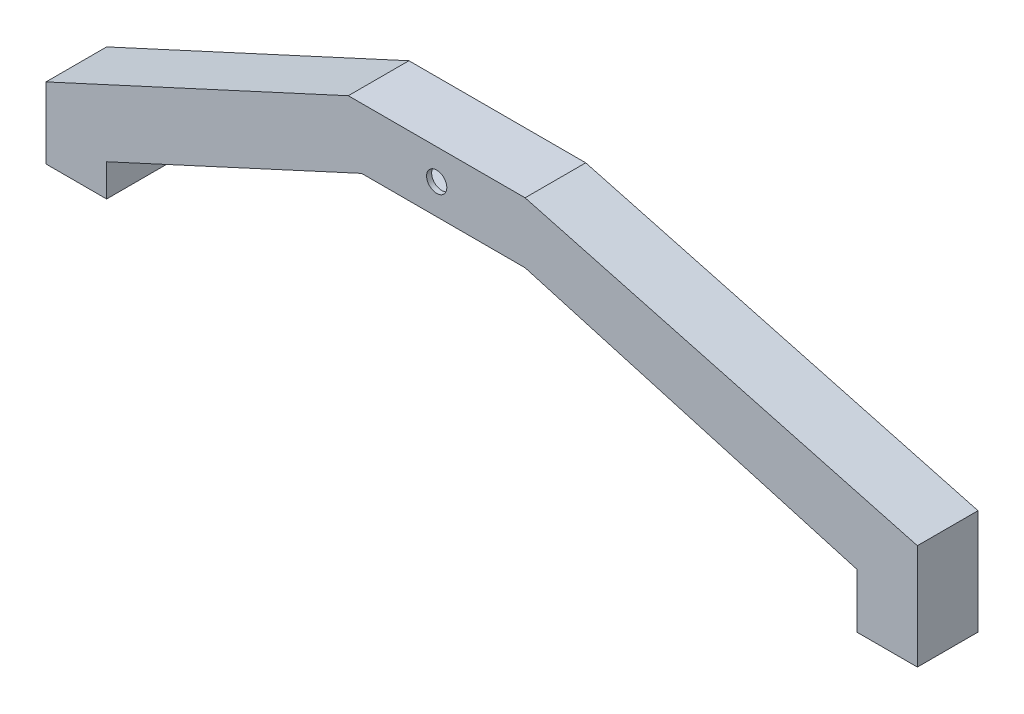
ISO-10303-21;
HEADER;
FILE_DESCRIPTION(('STEP AP214'),'2;1');
FILE_NAME('part.step','',(''),(''),'','','');
FILE_SCHEMA(('AUTOMOTIVE_DESIGN { 1 0 10303 214 1 1 1 1 }'));
ENDSEC;
DATA;
#1=APPLICATION_CONTEXT('core data for automotive mechanical design processes');
#2=APPLICATION_PROTOCOL_DEFINITION('international standard','automotive_design',2000,#1);
#3=PRODUCT_CONTEXT('',#1,'mechanical');
#4=PRODUCT('Part','Part','',(#3));
#5=PRODUCT_RELATED_PRODUCT_CATEGORY('part','',(#4));
#6=PRODUCT_DEFINITION_FORMATION('','',#4);
#7=PRODUCT_DEFINITION_CONTEXT('part definition',#1,'design');
#8=PRODUCT_DEFINITION('design','',#6,#7);
#9=PRODUCT_DEFINITION_SHAPE('','',#8);
#10=(LENGTH_UNIT() NAMED_UNIT(*) SI_UNIT(.MILLI.,.METRE.));
#11=(NAMED_UNIT(*) PLANE_ANGLE_UNIT() SI_UNIT($,.RADIAN.));
#12=(NAMED_UNIT(*) SI_UNIT($,.STERADIAN.) SOLID_ANGLE_UNIT());
#13=UNCERTAINTY_MEASURE_WITH_UNIT(LENGTH_MEASURE(1.E-05),#10,'distance_accuracy_value','');
#14=(GEOMETRIC_REPRESENTATION_CONTEXT(3) GLOBAL_UNCERTAINTY_ASSIGNED_CONTEXT((#13)) GLOBAL_UNIT_ASSIGNED_CONTEXT((#10,
#11,#12)) REPRESENTATION_CONTEXT('',''));
#15=CARTESIAN_POINT('',(0.,0.,0.));
#16=DIRECTION('',(0.,0.,1.));
#17=DIRECTION('',(1.,0.,0.));
#18=AXIS2_PLACEMENT_3D('',#15,#16,#17);
#19=CARTESIAN_POINT('',(0.,-35.63,12.));
#20=DIRECTION('',(0.,1.,0.));
#21=DIRECTION('',(0.,0.,1.));
#22=AXIS2_PLACEMENT_3D('',#19,#20,#21);
#23=PLANE('',#22);
#24=DIRECTION('',(-1.,0.,0.));
#25=VECTOR('',#24,1.);
#26=CARTESIAN_POINT('',(84.1570943734744,-35.63,11.1013641627953));
#27=LINE('',#26,#25);
#28=CARTESIAN_POINT('',(94.1570943734744,-35.63,11.1013641627953));
#29=VERTEX_POINT('',#28);
#30=CARTESIAN_POINT('',(84.1570943734744,-35.63,11.1013641627953));
#31=VERTEX_POINT('',#30);
#32=EDGE_CURVE('E445',#29,#31,#27,.T.);
#33=ORIENTED_EDGE('',*,*,#32,.F.);
#34=DIRECTION('',(0.,0.,1.));
#35=VECTOR('',#34,1.);
#36=CARTESIAN_POINT('',(94.1570943734744,-35.63,11.1013641627953));
#37=LINE('',#36,#35);
#38=CARTESIAN_POINT('',(94.1570943734744,-35.63,1.10136416279526));
#39=VERTEX_POINT('',#38);
#40=EDGE_CURVE('E59',#39,#29,#37,.T.);
#41=ORIENTED_EDGE('',*,*,#40,.F.);
#42=DIRECTION('',(1.,0.,0.));
#43=VECTOR('',#42,1.);
#44=CARTESIAN_POINT('',(84.1570943734744,-35.63,1.10136416279526));
#45=LINE('',#44,#43);
#46=CARTESIAN_POINT('',(84.1570943734744,-35.63,1.10136416279526));
#47=VERTEX_POINT('',#46);
#48=EDGE_CURVE('E323',#47,#39,#45,.T.);
#49=ORIENTED_EDGE('',*,*,#48,.F.);
#50=DIRECTION('',(0.,0.,-1.));
#51=VECTOR('',#50,1.);
#52=CARTESIAN_POINT('',(84.1570943734744,-35.63,11.1013641627953));
#53=LINE('',#52,#51);
#54=EDGE_CURVE('E448',#31,#47,#53,.T.);
#55=ORIENTED_EDGE('',*,*,#54,.F.);
#56=EDGE_LOOP('',(#33,#41,#49,#55));
#57=FACE_BOUND('',#56,.T.);
#58=DIRECTION('',(0.,0.,-1.));
#59=VECTOR('',#58,1.);
#60=CARTESIAN_POINT('',(83.1570943734744,-35.63,0.));
#61=LINE('',#60,#59);
#62=CARTESIAN_POINT('',(83.1570943734744,-35.63,12.));
#63=VERTEX_POINT('',#62);
#64=CARTESIAN_POINT('',(83.1570943734744,-35.63,0.));
#65=VERTEX_POINT('',#64);
#66=EDGE_CURVE('E233',#63,#65,#61,.T.);
#67=ORIENTED_EDGE('',*,*,#66,.T.);
#68=DIRECTION('',(1.,0.,0.));
#69=VECTOR('',#68,1.);
#70=CARTESIAN_POINT('',(0.,-35.63,0.));
#71=LINE('',#70,#69);
#72=CARTESIAN_POINT('',(95.1570943734744,-35.63,0.));
#73=VERTEX_POINT('',#72);
#74=EDGE_CURVE('E243',#65,#73,#71,.T.);
#75=ORIENTED_EDGE('',*,*,#74,.T.);
#76=DIRECTION('',(0.,0.,-1.));
#77=VECTOR('',#76,1.);
#78=CARTESIAN_POINT('',(95.1570943734744,-35.63,12.));
#79=LINE('',#78,#77);
#80=CARTESIAN_POINT('',(95.1570943734744,-35.63,12.));
#81=VERTEX_POINT('',#80);
#82=EDGE_CURVE('E303',#81,#73,#79,.T.);
#83=ORIENTED_EDGE('',*,*,#82,.F.);
#84=DIRECTION('',(1.,0.,0.));
#85=VECTOR('',#84,1.);
#86=CARTESIAN_POINT('',(0.,-35.63,12.));
#87=LINE('',#86,#85);
#88=EDGE_CURVE('E245',#63,#81,#87,.T.);
#89=ORIENTED_EDGE('',*,*,#88,.F.);
#90=EDGE_LOOP('',(#67,#75,#83,#89));
#91=FACE_BOUND('',#90,.T.);
#92=ADVANCED_FACE('F36',(#57,#91),#23,.F.);
#93=CARTESIAN_POINT('',(0.,-35.63,12.));
#94=DIRECTION('',(0.,1.,0.));
#95=DIRECTION('',(0.,0.,1.));
#96=AXIS2_PLACEMENT_3D('',#93,#94,#95);
#97=PLANE('',#96);
#98=DIRECTION('',(1.,0.,0.));
#99=VECTOR('',#98,1.);
#100=CARTESIAN_POINT('',(0.,-35.63,0.));
#101=LINE('',#100,#99);
#102=CARTESIAN_POINT('',(-77.3429056265256,-35.63,0.));
#103=VERTEX_POINT('',#102);
#104=CARTESIAN_POINT('',(-65.3429056265256,-35.63,0.));
#105=VERTEX_POINT('',#104);
#106=EDGE_CURVE('E271',#103,#105,#101,.T.);
#107=ORIENTED_EDGE('',*,*,#106,.T.);
#108=DIRECTION('',(0.,0.,-1.));
#109=VECTOR('',#108,1.);
#110=CARTESIAN_POINT('',(-65.3429056265256,-35.63,12.));
#111=LINE('',#110,#109);
#112=CARTESIAN_POINT('',(-65.3429056265256,-35.63,12.));
#113=VERTEX_POINT('',#112);
#114=EDGE_CURVE('E289',#113,#105,#111,.T.);
#115=ORIENTED_EDGE('',*,*,#114,.F.);
#116=DIRECTION('',(1.,0.,0.));
#117=VECTOR('',#116,1.);
#118=CARTESIAN_POINT('',(0.,-35.63,12.));
#119=LINE('',#118,#117);
#120=CARTESIAN_POINT('',(-77.3429056265256,-35.63,12.));
#121=VERTEX_POINT('',#120);
#122=EDGE_CURVE('E417',#121,#113,#119,.T.);
#123=ORIENTED_EDGE('',*,*,#122,.F.);
#124=DIRECTION('',(0.,0.,-1.));
#125=VECTOR('',#124,1.);
#126=CARTESIAN_POINT('',(-77.3429056265256,-35.63,12.));
#127=LINE('',#126,#125);
#128=EDGE_CURVE('E291',#121,#103,#127,.T.);
#129=ORIENTED_EDGE('',*,*,#128,.T.);
#130=EDGE_LOOP('',(#107,#115,#123,#129));
#131=FACE_BOUND('',#130,.T.);
#132=DIRECTION('',(1.,0.,0.));
#133=VECTOR('',#132,1.);
#134=CARTESIAN_POINT('',(0.,-35.63,1.));
#135=LINE('',#134,#133);
#136=CARTESIAN_POINT('',(-76.3429056265256,-35.63,1.));
#137=VERTEX_POINT('',#136);
#138=CARTESIAN_POINT('',(-66.3429056265256,-35.63,1.));
#139=VERTEX_POINT('',#138);
#140=EDGE_CURVE('E364',#137,#139,#135,.T.);
#141=ORIENTED_EDGE('',*,*,#140,.F.);
#142=DIRECTION('',(0.,0.,-1.));
#143=VECTOR('',#142,1.);
#144=CARTESIAN_POINT('',(-76.3429056265256,-35.63,12.));
#145=LINE('',#144,#143);
#146=CARTESIAN_POINT('',(-76.3429056265256,-35.63,11.));
#147=VERTEX_POINT('',#146);
#148=EDGE_CURVE('E360',#147,#137,#145,.T.);
#149=ORIENTED_EDGE('',*,*,#148,.F.);
#150=DIRECTION('',(1.,0.,0.));
#151=VECTOR('',#150,1.);
#152=CARTESIAN_POINT('',(0.,-35.63,11.));
#153=LINE('',#152,#151);
#154=CARTESIAN_POINT('',(-66.3429056265256,-35.63,11.));
#155=VERTEX_POINT('',#154);
#156=EDGE_CURVE('E367',#147,#155,#153,.T.);
#157=ORIENTED_EDGE('',*,*,#156,.T.);
#158=DIRECTION('',(0.,0.,-1.));
#159=VECTOR('',#158,1.);
#160=CARTESIAN_POINT('',(-66.3429056265256,-35.63,12.));
#161=LINE('',#160,#159);
#162=EDGE_CURVE('E384',#155,#139,#161,.T.);
#163=ORIENTED_EDGE('',*,*,#162,.T.);
#164=EDGE_LOOP('',(#141,#149,#157,#163));
#165=FACE_BOUND('',#164,.T.);
#166=ADVANCED_FACE('F498',(#131,#165),#97,.F.);
#167=CARTESIAN_POINT('',(95.1570943734744,0.,12.));
#168=DIRECTION('',(-1.,0.,0.));
#169=DIRECTION('',(0.,-1.,0.));
#170=AXIS2_PLACEMENT_3D('',#167,#168,#169);
#171=PLANE('',#170);
#172=DIRECTION('',(0.,1.,0.));
#173=VECTOR('',#172,1.);
#174=CARTESIAN_POINT('',(95.1570943734744,0.,0.));
#175=LINE('',#174,#173);
#176=CARTESIAN_POINT('',(95.1570943734744,-14.8129402340894,0.));
#177=VERTEX_POINT('',#176);
#178=EDGE_CURVE('E252',#73,#177,#175,.T.);
#179=ORIENTED_EDGE('',*,*,#178,.T.);
#180=DIRECTION('',(0.,0.,-1.));
#181=VECTOR('',#180,1.);
#182=CARTESIAN_POINT('',(95.1570943734744,-14.8129402340894,12.));
#183=LINE('',#182,#181);
#184=CARTESIAN_POINT('',(95.1570943734744,-14.8129402340894,12.));
#185=VERTEX_POINT('',#184);
#186=EDGE_CURVE('E301',#185,#177,#183,.T.);
#187=ORIENTED_EDGE('',*,*,#186,.F.);
#188=DIRECTION('',(0.,1.,0.));
#189=VECTOR('',#188,1.);
#190=CARTESIAN_POINT('',(95.1570943734744,0.,12.));
#191=LINE('',#190,#189);
#192=EDGE_CURVE('E405',#81,#185,#191,.T.);
#193=ORIENTED_EDGE('',*,*,#192,.F.);
#194=ORIENTED_EDGE('',*,*,#82,.T.);
#195=EDGE_LOOP('',(#179,#187,#193,#194));
#196=FACE_BOUND('',#195,.T.);
#197=ADVANCED_FACE('F550',(#196),#171,.F.);
#198=CARTESIAN_POINT('',(2.67307941964204,9.97377489312796,12.));
#199=DIRECTION('',(0.258874568706101,0.965910947073916,0.));
#200=DIRECTION('',(-0.965910947073917,0.258874568706101,0.));
#201=AXIS2_PLACEMENT_3D('',#198,#199,#200);
#202=PLANE('',#201);
#203=DIRECTION('',(0.965910947073917,-0.258874568706101,0.));
#204=VECTOR('',#203,1.);
#205=CARTESIAN_POINT('',(2.67307941964204,9.97377489312796,0.));
#206=LINE('',#205,#204);
#207=CARTESIAN_POINT('',(17.5,6.,0.));
#208=VERTEX_POINT('',#207);
#209=EDGE_CURVE('E255',#208,#177,#206,.T.);
#210=ORIENTED_EDGE('',*,*,#209,.F.);
#211=DIRECTION('',(0.,0.,-1.));
#212=VECTOR('',#211,1.);
#213=CARTESIAN_POINT('',(17.5,6.,12.));
#214=LINE('',#213,#212);
#215=CARTESIAN_POINT('',(17.5,6.,12.));
#216=VERTEX_POINT('',#215);
#217=EDGE_CURVE('E299',#216,#208,#214,.T.);
#218=ORIENTED_EDGE('',*,*,#217,.F.);
#219=DIRECTION('',(0.965910947073917,-0.258874568706101,0.));
#220=VECTOR('',#219,1.);
#221=CARTESIAN_POINT('',(2.67307941964204,9.97377489312796,12.));
#222=LINE('',#221,#220);
#223=EDGE_CURVE('E407',#216,#185,#222,.T.);
#224=ORIENTED_EDGE('',*,*,#223,.T.);
#225=ORIENTED_EDGE('',*,*,#186,.T.);
#226=EDGE_LOOP('',(#210,#218,#224,#225));
#227=FACE_BOUND('',#226,.T.);
#228=ADVANCED_FACE('F556',(#227),#202,.T.);
#229=CARTESIAN_POINT('',(0.,6.,12.));
#230=DIRECTION('',(0.,1.,0.));
#231=DIRECTION('',(0.,0.,1.));
#232=AXIS2_PLACEMENT_3D('',#229,#230,#231);
#233=PLANE('',#232);
#234=DIRECTION('',(1.,0.,0.));
#235=VECTOR('',#234,1.);
#236=CARTESIAN_POINT('',(0.,6.,0.));
#237=LINE('',#236,#235);
#238=CARTESIAN_POINT('',(-17.5,6.,0.));
#239=VERTEX_POINT('',#238);
#240=EDGE_CURVE('E264',#239,#208,#237,.T.);
#241=ORIENTED_EDGE('',*,*,#240,.F.);
#242=DIRECTION('',(0.,0.,-1.));
#243=VECTOR('',#242,1.);
#244=CARTESIAN_POINT('',(-17.5,6.,12.));
#245=LINE('',#244,#243);
#246=CARTESIAN_POINT('',(-17.5,6.,12.));
#247=VERTEX_POINT('',#246);
#248=EDGE_CURVE('E297',#247,#239,#245,.T.);
#249=ORIENTED_EDGE('',*,*,#248,.F.);
#250=DIRECTION('',(1.,0.,0.));
#251=VECTOR('',#250,1.);
#252=CARTESIAN_POINT('',(0.,6.,12.));
#253=LINE('',#252,#251);
#254=EDGE_CURVE('E410',#247,#216,#253,.T.);
#255=ORIENTED_EDGE('',*,*,#254,.T.);
#256=ORIENTED_EDGE('',*,*,#217,.T.);
#257=EDGE_LOOP('',(#241,#249,#255,#256));
#258=FACE_BOUND('',#257,.T.);
#259=ADVANCED_FACE('F569',(#258),#233,.T.);
#260=CARTESIAN_POINT('',(-5.33954145582519,11.598329635369,12.));
#261=DIRECTION('',(0.418184177516303,-0.90836225905473,0.));
#262=DIRECTION('',(0.90836225905473,0.418184177516303,0.));
#263=AXIS2_PLACEMENT_3D('',#260,#261,#262);
#264=PLANE('',#263);
#265=DIRECTION('',(-0.90836225905473,-0.418184177516303,0.));
#266=VECTOR('',#265,1.);
#267=CARTESIAN_POINT('',(-5.33954145582519,11.598329635369,0.));
#268=LINE('',#267,#266);
#269=CARTESIAN_POINT('',(-77.3429056265256,-21.549973614774,0.));
#270=VERTEX_POINT('',#269);
#271=EDGE_CURVE('E267',#239,#270,#268,.T.);
#272=ORIENTED_EDGE('',*,*,#271,.T.);
#273=DIRECTION('',(0.,0.,-1.));
#274=VECTOR('',#273,1.);
#275=CARTESIAN_POINT('',(-77.3429056265256,-21.549973614774,12.));
#276=LINE('',#275,#274);
#277=CARTESIAN_POINT('',(-77.3429056265256,-21.549973614774,12.));
#278=VERTEX_POINT('',#277);
#279=EDGE_CURVE('E294',#278,#270,#276,.T.);
#280=ORIENTED_EDGE('',*,*,#279,.F.);
#281=DIRECTION('',(-0.90836225905473,-0.418184177516303,0.));
#282=VECTOR('',#281,1.);
#283=CARTESIAN_POINT('',(-5.33954145582519,11.598329635369,12.));
#284=LINE('',#283,#282);
#285=EDGE_CURVE('E413',#247,#278,#284,.T.);
#286=ORIENTED_EDGE('',*,*,#285,.F.);
#287=ORIENTED_EDGE('',*,*,#248,.T.);
#288=EDGE_LOOP('',(#272,#280,#286,#287));
#289=FACE_BOUND('',#288,.T.);
#290=ADVANCED_FACE('F565',(#289),#264,.F.);
#291=CARTESIAN_POINT('',(-77.3429056265256,0.,12.));
#292=DIRECTION('',(1.,0.,0.));
#293=DIRECTION('',(0.,0.,-1.));
#294=AXIS2_PLACEMENT_3D('',#291,#292,#293);
#295=PLANE('',#294);
#296=DIRECTION('',(0.,-1.,0.));
#297=VECTOR('',#296,1.);
#298=CARTESIAN_POINT('',(-77.3429056265256,0.,0.));
#299=LINE('',#298,#297);
#300=EDGE_CURVE('E269',#270,#103,#299,.T.);
#301=ORIENTED_EDGE('',*,*,#300,.T.);
#302=ORIENTED_EDGE('',*,*,#128,.F.);
#303=DIRECTION('',(0.,-1.,0.));
#304=VECTOR('',#303,1.);
#305=CARTESIAN_POINT('',(-77.3429056265256,0.,12.));
#306=LINE('',#305,#304);
#307=EDGE_CURVE('E415',#278,#121,#306,.T.);
#308=ORIENTED_EDGE('',*,*,#307,.F.);
#309=ORIENTED_EDGE('',*,*,#279,.T.);
#310=EDGE_LOOP('',(#301,#302,#308,#309));
#311=FACE_BOUND('',#310,.T.);
#312=ADVANCED_FACE('F562',(#311),#295,.F.);
#313=CARTESIAN_POINT('',(-65.3429056265256,0.,12.));
#314=DIRECTION('',(1.,0.,0.));
#315=DIRECTION('',(0.,0.,-1.));
#316=AXIS2_PLACEMENT_3D('',#313,#314,#315);
#317=PLANE('',#316);
#318=DIRECTION('',(0.,-1.,0.));
#319=VECTOR('',#318,1.);
#320=CARTESIAN_POINT('',(-65.3429056265256,0.,0.));
#321=LINE('',#320,#319);
#322=CARTESIAN_POINT('',(-65.3429056265256,-29.2361030198748,0.));
#323=VERTEX_POINT('',#322);
#324=EDGE_CURVE('E274',#323,#105,#321,.T.);
#325=ORIENTED_EDGE('',*,*,#324,.F.);
#326=DIRECTION('',(0.,0.,-1.));
#327=VECTOR('',#326,1.);
#328=CARTESIAN_POINT('',(-65.3429056265256,-29.2361030198748,12.));
#329=LINE('',#328,#327);
#330=CARTESIAN_POINT('',(-65.3429056265256,-29.2361030198748,12.));
#331=VERTEX_POINT('',#330);
#332=EDGE_CURVE('E287',#331,#323,#329,.T.);
#333=ORIENTED_EDGE('',*,*,#332,.F.);
#334=DIRECTION('',(0.,-1.,0.));
#335=VECTOR('',#334,1.);
#336=CARTESIAN_POINT('',(-65.3429056265256,0.,12.));
#337=LINE('',#336,#335);
#338=EDGE_CURVE('E419',#331,#113,#337,.T.);
#339=ORIENTED_EDGE('',*,*,#338,.T.);
#340=ORIENTED_EDGE('',*,*,#114,.T.);
#341=EDGE_LOOP('',(#325,#333,#339,#340));
#342=FACE_BOUND('',#341,.T.);
#343=ADVANCED_FACE('F560',(#342),#317,.T.);
#344=CARTESIAN_POINT('',(-0.321331325629684,0.697982526712524,12.));
#345=DIRECTION('',(-0.418184177516307,0.908362259054728,0.));
#346=DIRECTION('',(-0.908362259054729,-0.418184177516307,0.));
#347=AXIS2_PLACEMENT_3D('',#344,#345,#346);
#348=PLANE('',#347);
#349=DIRECTION('',(0.908362259054729,0.418184177516307,0.));
#350=VECTOR('',#349,1.);
#351=CARTESIAN_POINT('',(-0.321331325629684,0.697982526712524,0.));
#352=LINE('',#351,#350);
#353=CARTESIAN_POINT('',(-14.8704100956806,-6.,0.));
#354=VERTEX_POINT('',#353);
#355=EDGE_CURVE('E277',#323,#354,#352,.T.);
#356=ORIENTED_EDGE('',*,*,#355,.T.);
#357=DIRECTION('',(0.,0.,-1.));
#358=VECTOR('',#357,1.);
#359=CARTESIAN_POINT('',(-14.8704100956806,-6.,12.));
#360=LINE('',#359,#358);
#361=CARTESIAN_POINT('',(-14.8704100956806,-6.,12.));
#362=VERTEX_POINT('',#361);
#363=EDGE_CURVE('E284',#362,#354,#360,.T.);
#364=ORIENTED_EDGE('',*,*,#363,.F.);
#365=DIRECTION('',(0.908362259054729,0.418184177516307,0.));
#366=VECTOR('',#365,1.);
#367=CARTESIAN_POINT('',(-0.321331325629684,0.697982526712524,12.));
#368=LINE('',#367,#366);
#369=EDGE_CURVE('E422',#331,#362,#368,.T.);
#370=ORIENTED_EDGE('',*,*,#369,.F.);
#371=ORIENTED_EDGE('',*,*,#332,.T.);
#372=EDGE_LOOP('',(#356,#364,#370,#371));
#373=FACE_BOUND('',#372,.T.);
#374=ADVANCED_FACE('F600',(#373),#348,.F.);
#375=CARTESIAN_POINT('',(0.,-6.,12.));
#376=DIRECTION('',(0.,1.,0.));
#377=DIRECTION('',(-1.,0.,0.));
#378=AXIS2_PLACEMENT_3D('',#375,#376,#377);
#379=PLANE('',#378);
#380=DIRECTION('',(1.,0.,0.));
#381=VECTOR('',#380,1.);
#382=CARTESIAN_POINT('',(0.,-6.,0.));
#383=LINE('',#382,#381);
#384=CARTESIAN_POINT('',(17.5,-6.,0.));
#385=VERTEX_POINT('',#384);
#386=EDGE_CURVE('E279',#354,#385,#383,.T.);
#387=ORIENTED_EDGE('',*,*,#386,.T.);
#388=DIRECTION('',(0.,0.,-1.));
#389=VECTOR('',#388,1.);
#390=CARTESIAN_POINT('',(17.5,-6.,12.));
#391=LINE('',#390,#389);
#392=CARTESIAN_POINT('',(17.5,-6.,12.));
#393=VERTEX_POINT('',#392);
#394=EDGE_CURVE('E282',#393,#385,#391,.T.);
#395=ORIENTED_EDGE('',*,*,#394,.F.);
#396=DIRECTION('',(1.,0.,0.));
#397=VECTOR('',#396,1.);
#398=CARTESIAN_POINT('',(0.,-6.,12.));
#399=LINE('',#398,#397);
#400=EDGE_CURVE('E423',#362,#393,#399,.T.);
#401=ORIENTED_EDGE('',*,*,#400,.F.);
#402=ORIENTED_EDGE('',*,*,#363,.T.);
#403=EDGE_LOOP('',(#387,#395,#401,#402));
#404=FACE_BOUND('',#403,.T.);
#405=ADVANCED_FACE('F603',(#404),#379,.F.);
#406=CARTESIAN_POINT('',(-0.259447612753441,-0.904205708316933,12.));
#407=DIRECTION('',(0.275805123433625,0.961213573503705,0.));
#408=DIRECTION('',(-0.961213573503705,0.275805123433625,0.));
#409=AXIS2_PLACEMENT_3D('',#406,#407,#408);
#410=PLANE('',#409);
#411=DIRECTION('',(0.961213573503705,-0.275805123433625,0.));
#412=VECTOR('',#411,1.);
#413=CARTESIAN_POINT('',(-0.259447612753441,-0.904205708316933,0.));
#414=LINE('',#413,#412);
#415=CARTESIAN_POINT('',(83.1570943734744,-24.839271018575,0.));
#416=VERTEX_POINT('',#415);
#417=EDGE_CURVE('E51',#385,#416,#414,.T.);
#418=ORIENTED_EDGE('',*,*,#417,.T.);
#419=DIRECTION('',(0.,0.,-1.));
#420=VECTOR('',#419,1.);
#421=CARTESIAN_POINT('',(83.1570943734744,-24.839271018575,0.));
#422=LINE('',#421,#420);
#423=CARTESIAN_POINT('',(83.1570943734744,-24.839271018575,12.));
#424=VERTEX_POINT('',#423);
#425=EDGE_CURVE('E235',#424,#416,#422,.T.);
#426=ORIENTED_EDGE('',*,*,#425,.F.);
#427=DIRECTION('',(0.961213573503705,-0.275805123433625,0.));
#428=VECTOR('',#427,1.);
#429=CARTESIAN_POINT('',(-0.259447612753441,-0.904205708316933,12.));
#430=LINE('',#429,#428);
#431=EDGE_CURVE('E260',#393,#424,#430,.T.);
#432=ORIENTED_EDGE('',*,*,#431,.F.);
#433=ORIENTED_EDGE('',*,*,#394,.T.);
#434=EDGE_LOOP('',(#418,#426,#432,#433));
#435=FACE_BOUND('',#434,.T.);
#436=ADVANCED_FACE('F430',(#435),#410,.F.);
#437=CARTESIAN_POINT('',(0.,0.,12.));
#438=DIRECTION('',(0.,0.,1.));
#439=DIRECTION('',(1.,0.,0.));
#440=AXIS2_PLACEMENT_3D('',#437,#438,#439);
#441=PLANE('',#440);
#442=ORIENTED_EDGE('',*,*,#431,.T.);
#443=DIRECTION('',(0.,-1.,0.));
#444=VECTOR('',#443,1.);
#445=CARTESIAN_POINT('',(83.1570943734744,-12.5638648482275,12.));
#446=LINE('',#445,#444);
#447=EDGE_CURVE('E238',#424,#63,#446,.T.);
#448=ORIENTED_EDGE('',*,*,#447,.T.);
#449=ORIENTED_EDGE('',*,*,#88,.T.);
#450=ORIENTED_EDGE('',*,*,#192,.T.);
#451=ORIENTED_EDGE('',*,*,#223,.F.);
#452=ORIENTED_EDGE('',*,*,#254,.F.);
#453=ORIENTED_EDGE('',*,*,#285,.T.);
#454=ORIENTED_EDGE('',*,*,#307,.T.);
#455=ORIENTED_EDGE('',*,*,#122,.T.);
#456=ORIENTED_EDGE('',*,*,#338,.F.);
#457=ORIENTED_EDGE('',*,*,#369,.T.);
#458=ORIENTED_EDGE('',*,*,#400,.T.);
#459=EDGE_LOOP('',(#442,#448,#449,#450,#451,#452,#453,#454,#455,#456,#457,#458));
#460=FACE_BOUND('',#459,.T.);
#461=CARTESIAN_POINT('',(0.,0.,12.));
#462=DIRECTION('',(0.,0.,1.));
#463=DIRECTION('',(1.,0.,0.));
#464=AXIS2_PLACEMENT_3D('',#461,#462,#463);
#465=CIRCLE('',#464,2.);
#466=CARTESIAN_POINT('',(2.00000000000001,0.,12.));
#467=VERTEX_POINT('',#466);
#468=EDGE_CURVE('E246',#467,#467,#465,.T.);
#469=ORIENTED_EDGE('',*,*,#468,.F.);
#470=EDGE_LOOP('',(#469));
#471=FACE_BOUND('',#470,.T.);
#472=ADVANCED_FACE('F428',(#460,#471),#441,.T.);
#473=CARTESIAN_POINT('',(0.,0.,0.));
#474=DIRECTION('',(0.,0.,1.));
#475=DIRECTION('',(1.,0.,0.));
#476=AXIS2_PLACEMENT_3D('',#473,#474,#475);
#477=PLANE('',#476);
#478=CARTESIAN_POINT('',(0.,0.,0.));
#479=DIRECTION('',(0.,0.,1.));
#480=DIRECTION('',(1.,0.,0.));
#481=AXIS2_PLACEMENT_3D('',#478,#479,#480);
#482=CIRCLE('',#481,2.);
#483=CARTESIAN_POINT('',(2.00000000000001,0.,0.));
#484=VERTEX_POINT('',#483);
#485=EDGE_CURVE('E434',#484,#484,#482,.T.);
#486=ORIENTED_EDGE('',*,*,#485,.T.);
#487=EDGE_LOOP('',(#486));
#488=FACE_BOUND('',#487,.T.);
#489=DIRECTION('',(0.,-1.,0.));
#490=VECTOR('',#489,1.);
#491=CARTESIAN_POINT('',(83.1570943734744,-12.5638648482275,0.));
#492=LINE('',#491,#490);
#493=EDGE_CURVE('E229',#416,#65,#492,.T.);
#494=ORIENTED_EDGE('',*,*,#493,.F.);
#495=ORIENTED_EDGE('',*,*,#417,.F.);
#496=ORIENTED_EDGE('',*,*,#386,.F.);
#497=ORIENTED_EDGE('',*,*,#355,.F.);
#498=ORIENTED_EDGE('',*,*,#324,.T.);
#499=ORIENTED_EDGE('',*,*,#106,.F.);
#500=ORIENTED_EDGE('',*,*,#300,.F.);
#501=ORIENTED_EDGE('',*,*,#271,.F.);
#502=ORIENTED_EDGE('',*,*,#240,.T.);
#503=ORIENTED_EDGE('',*,*,#209,.T.);
#504=ORIENTED_EDGE('',*,*,#178,.F.);
#505=ORIENTED_EDGE('',*,*,#74,.F.);
#506=EDGE_LOOP('',(#494,#495,#496,#497,#498,#499,#500,#501,#502,#503,#504,#505));
#507=FACE_BOUND('',#506,.T.);
#508=ADVANCED_FACE('F249',(#488,#507),#477,.F.);
#509=CARTESIAN_POINT('',(83.9390864933817,1.07330550602256E-13,12.));
#510=DIRECTION('',(-1.,0.,0.));
#511=DIRECTION('',(0.,-1.,0.));
#512=AXIS2_PLACEMENT_3D('',#509,#510,#511);
#513=PLANE('',#512);
#514=DIRECTION('',(0.,1.,0.));
#515=VECTOR('',#514,1.);
#516=CARTESIAN_POINT('',(83.9390864933817,1.07330550602256E-13,1.));
#517=LINE('',#516,#515);
#518=CARTESIAN_POINT('',(83.9390864933817,-34.63,1.));
#519=VERTEX_POINT('',#518);
#520=CARTESIAN_POINT('',(83.9390864933817,-24.0232998458148,1.));
#521=VERTEX_POINT('',#520);
#522=EDGE_CURVE('E464',#519,#521,#517,.T.);
#523=ORIENTED_EDGE('',*,*,#522,.T.);
#524=DIRECTION('',(0.,0.,-1.));
#525=VECTOR('',#524,1.);
#526=CARTESIAN_POINT('',(83.9390864933817,-24.0232998458148,12.));
#527=LINE('',#526,#525);
#528=CARTESIAN_POINT('',(83.9390864933817,-24.0232998458148,11.));
#529=VERTEX_POINT('',#528);
#530=EDGE_CURVE('E377',#529,#521,#527,.T.);
#531=ORIENTED_EDGE('',*,*,#530,.F.);
#532=DIRECTION('',(0.,1.,0.));
#533=VECTOR('',#532,1.);
#534=CARTESIAN_POINT('',(83.9390864933817,1.07330550602256E-13,11.));
#535=LINE('',#534,#533);
#536=CARTESIAN_POINT('',(83.9390864933817,-34.63,11.));
#537=VERTEX_POINT('',#536);
#538=EDGE_CURVE('E335',#537,#529,#535,.T.);
#539=ORIENTED_EDGE('',*,*,#538,.F.);
#540=DIRECTION('',(0.,0.,-1.));
#541=VECTOR('',#540,1.);
#542=CARTESIAN_POINT('',(83.9390864933817,-34.63,12.));
#543=LINE('',#542,#541);
#544=EDGE_CURVE('E253',#537,#519,#543,.T.);
#545=ORIENTED_EDGE('',*,*,#544,.T.);
#546=EDGE_LOOP('',(#523,#531,#539,#545));
#547=FACE_BOUND('',#546,.T.);
#548=ADVANCED_FACE('F520',(#547),#513,.F.);
#549=CARTESIAN_POINT('',(0.,-34.63,12.));
#550=DIRECTION('',(0.,1.,0.));
#551=DIRECTION('',(0.,0.,1.));
#552=AXIS2_PLACEMENT_3D('',#549,#550,#551);
#553=PLANE('',#552);
#554=DIRECTION('',(-1.,0.,0.));
#555=VECTOR('',#554,1.);
#556=CARTESIAN_POINT('',(0.,-34.63,1.10136416279526));
#557=LINE('',#556,#555);
#558=CARTESIAN_POINT('',(94.1570943734744,-34.63,1.10136416279526));
#559=VERTEX_POINT('',#558);
#560=CARTESIAN_POINT('',(84.1570943734744,-34.63,1.10136416279526));
#561=VERTEX_POINT('',#560);
#562=EDGE_CURVE('E462',#559,#561,#557,.T.);
#563=ORIENTED_EDGE('',*,*,#562,.F.);
#564=DIRECTION('',(0.,0.,-1.));
#565=VECTOR('',#564,1.);
#566=CARTESIAN_POINT('',(94.1570943734744,-34.63,12.));
#567=LINE('',#566,#565);
#568=CARTESIAN_POINT('',(94.1570943734744,-34.63,1.));
#569=VERTEX_POINT('',#568);
#570=EDGE_CURVE('E257',#559,#569,#567,.T.);
#571=ORIENTED_EDGE('',*,*,#570,.T.);
#572=DIRECTION('',(1.,0.,0.));
#573=VECTOR('',#572,1.);
#574=CARTESIAN_POINT('',(0.,-34.63,1.));
#575=LINE('',#574,#573);
#576=EDGE_CURVE('E466',#519,#569,#575,.T.);
#577=ORIENTED_EDGE('',*,*,#576,.F.);
#578=ORIENTED_EDGE('',*,*,#544,.F.);
#579=DIRECTION('',(1.,0.,0.));
#580=VECTOR('',#579,1.);
#581=CARTESIAN_POINT('',(0.,-34.63,11.));
#582=LINE('',#581,#580);
#583=CARTESIAN_POINT('',(84.1570943734744,-34.63,11.));
#584=VERTEX_POINT('',#583);
#585=EDGE_CURVE('E330',#537,#584,#582,.T.);
#586=ORIENTED_EDGE('',*,*,#585,.T.);
#587=DIRECTION('',(0.,0.,1.));
#588=VECTOR('',#587,1.);
#589=CARTESIAN_POINT('',(84.1570943734744,-34.63,12.));
#590=LINE('',#589,#588);
#591=EDGE_CURVE('E455',#561,#584,#590,.T.);
#592=ORIENTED_EDGE('',*,*,#591,.F.);
#593=EDGE_LOOP('',(#563,#571,#577,#578,#586,#592));
#594=FACE_BOUND('',#593,.T.);
#595=ADVANCED_FACE('F525',(#594),#553,.T.);
#596=CARTESIAN_POINT('',(94.1570943734744,0.,12.));
#597=DIRECTION('',(-1.,0.,0.));
#598=DIRECTION('',(0.,-1.,0.));
#599=AXIS2_PLACEMENT_3D('',#596,#597,#598);
#600=PLANE('',#599);
#601=ORIENTED_EDGE('',*,*,#570,.F.);
#602=DIRECTION('',(0.,-1.,0.));
#603=VECTOR('',#602,1.);
#604=CARTESIAN_POINT('',(94.1570943734744,-23.63,1.10136416279526));
#605=LINE('',#604,#603);
#606=EDGE_CURVE('E453',#559,#39,#605,.T.);
#607=ORIENTED_EDGE('',*,*,#606,.T.);
#608=ORIENTED_EDGE('',*,*,#40,.T.);
#609=DIRECTION('',(0.,-1.,0.));
#610=VECTOR('',#609,1.);
#611=CARTESIAN_POINT('',(94.1570943734744,-23.63,11.1013641627953));
#612=LINE('',#611,#610);
#613=CARTESIAN_POINT('',(94.1570943734744,-23.63,11.1013641627953));
#614=VERTEX_POINT('',#613);
#615=EDGE_CURVE('E320',#614,#29,#612,.T.);
#616=ORIENTED_EDGE('',*,*,#615,.F.);
#617=DIRECTION('',(0.,0.,1.));
#618=VECTOR('',#617,1.);
#619=CARTESIAN_POINT('',(94.1570943734744,-23.63,11.1013641627953));
#620=LINE('',#619,#618);
#621=CARTESIAN_POINT('',(94.1570943734744,-23.63,11.));
#622=VERTEX_POINT('',#621);
#623=EDGE_CURVE('E310',#622,#614,#620,.T.);
#624=ORIENTED_EDGE('',*,*,#623,.F.);
#625=DIRECTION('',(0.,1.,0.));
#626=VECTOR('',#625,1.);
#627=CARTESIAN_POINT('',(94.1570943734744,0.,11.));
#628=LINE('',#627,#626);
#629=CARTESIAN_POINT('',(94.1570943734744,-15.5802215590801,11.));
#630=VERTEX_POINT('',#629);
#631=EDGE_CURVE('E318',#622,#630,#628,.T.);
#632=ORIENTED_EDGE('',*,*,#631,.T.);
#633=DIRECTION('',(0.,0.,-1.));
#634=VECTOR('',#633,1.);
#635=CARTESIAN_POINT('',(94.1570943734744,-15.5802215590801,12.));
#636=LINE('',#635,#634);
#637=CARTESIAN_POINT('',(94.1570943734744,-15.5802215590801,1.));
#638=VERTEX_POINT('',#637);
#639=EDGE_CURVE('E339',#630,#638,#636,.T.);
#640=ORIENTED_EDGE('',*,*,#639,.T.);
#641=DIRECTION('',(0.,1.,0.));
#642=VECTOR('',#641,1.);
#643=CARTESIAN_POINT('',(94.1570943734744,0.,1.));
#644=LINE('',#643,#642);
#645=EDGE_CURVE('E345',#569,#638,#644,.T.);
#646=ORIENTED_EDGE('',*,*,#645,.F.);
#647=EDGE_LOOP('',(#601,#607,#608,#616,#624,#632,#640,#646));
#648=FACE_BOUND('',#647,.T.);
#649=ADVANCED_FACE('F317',(#648),#600,.T.);
#650=CARTESIAN_POINT('',(2.41420485093594,9.00786394605404,12.));
#651=DIRECTION('',(0.258874568706101,0.965910947073916,0.));
#652=DIRECTION('',(-0.965910947073917,0.258874568706101,0.));
#653=AXIS2_PLACEMENT_3D('',#650,#651,#652);
#654=PLANE('',#653);
#655=DIRECTION('',(0.965910947073917,-0.258874568706101,0.));
#656=VECTOR('',#655,1.);
#657=CARTESIAN_POINT('',(2.41420485093594,9.00786394605404,1.));
#658=LINE('',#657,#656);
#659=CARTESIAN_POINT('',(17.3683182627924,5.,1.));
#660=VERTEX_POINT('',#659);
#661=EDGE_CURVE('E341',#660,#638,#658,.T.);
#662=ORIENTED_EDGE('',*,*,#661,.T.);
#663=ORIENTED_EDGE('',*,*,#639,.F.);
#664=DIRECTION('',(0.965910947073917,-0.258874568706101,0.));
#665=VECTOR('',#664,1.);
#666=CARTESIAN_POINT('',(2.41420485093594,9.00786394605404,11.));
#667=LINE('',#666,#665);
#668=CARTESIAN_POINT('',(17.3683182627924,5.,11.));
#669=VERTEX_POINT('',#668);
#670=EDGE_CURVE('E329',#669,#630,#667,.T.);
#671=ORIENTED_EDGE('',*,*,#670,.F.);
#672=DIRECTION('',(0.,0.,-1.));
#673=VECTOR('',#672,1.);
#674=CARTESIAN_POINT('',(17.3683182627924,5.,12.));
#675=LINE('',#674,#673);
#676=EDGE_CURVE('E346',#669,#660,#675,.T.);
#677=ORIENTED_EDGE('',*,*,#676,.T.);
#678=EDGE_LOOP('',(#662,#663,#671,#677));
#679=FACE_BOUND('',#678,.T.);
#680=ADVANCED_FACE('F482',(#679),#654,.F.);
#681=CARTESIAN_POINT('',(0.,5.,12.));
#682=DIRECTION('',(0.,1.,0.));
#683=DIRECTION('',(0.,0.,1.));
#684=AXIS2_PLACEMENT_3D('',#681,#682,#683);
#685=PLANE('',#684);
#686=DIRECTION('',(1.,0.,0.));
#687=VECTOR('',#686,1.);
#688=CARTESIAN_POINT('',(0.,5.,1.));
#689=LINE('',#688,#687);
#690=CARTESIAN_POINT('',(-17.2808675079733,5.,1.));
#691=VERTEX_POINT('',#690);
#692=EDGE_CURVE('E344',#691,#660,#689,.T.);
#693=ORIENTED_EDGE('',*,*,#692,.T.);
#694=ORIENTED_EDGE('',*,*,#676,.F.);
#695=DIRECTION('',(1.,0.,0.));
#696=VECTOR('',#695,1.);
#697=CARTESIAN_POINT('',(0.,5.,11.));
#698=LINE('',#697,#696);
#699=CARTESIAN_POINT('',(-17.2808675079733,5.,11.));
#700=VERTEX_POINT('',#699);
#701=EDGE_CURVE('E332',#700,#669,#698,.T.);
#702=ORIENTED_EDGE('',*,*,#701,.F.);
#703=DIRECTION('',(0.,0.,-1.));
#704=VECTOR('',#703,1.);
#705=CARTESIAN_POINT('',(-17.2808675079733,5.,12.));
#706=LINE('',#705,#704);
#707=EDGE_CURVE('E347',#700,#691,#706,.T.);
#708=ORIENTED_EDGE('',*,*,#707,.T.);
#709=EDGE_LOOP('',(#693,#694,#702,#708));
#710=FACE_BOUND('',#709,.T.);
#711=ADVANCED_FACE('F485',(#710),#685,.F.);
#712=CARTESIAN_POINT('',(-4.92135727830889,10.6899673763143,12.));
#713=DIRECTION('',(0.418184177516303,-0.90836225905473,0.));
#714=DIRECTION('',(0.90836225905473,0.418184177516303,0.));
#715=AXIS2_PLACEMENT_3D('',#712,#713,#714);
#716=PLANE('',#715);
#717=DIRECTION('',(-0.90836225905473,-0.418184177516303,0.));
#718=VECTOR('',#717,1.);
#719=CARTESIAN_POINT('',(-4.92135727830889,10.6899673763143,1.));
#720=LINE('',#719,#718);
#721=CARTESIAN_POINT('',(-76.3429056265256,-22.1904843985325,1.));
#722=VERTEX_POINT('',#721);
#723=EDGE_CURVE('E351',#691,#722,#720,.T.);
#724=ORIENTED_EDGE('',*,*,#723,.F.);
#725=ORIENTED_EDGE('',*,*,#707,.F.);
#726=DIRECTION('',(-0.90836225905473,-0.418184177516303,0.));
#727=VECTOR('',#726,1.);
#728=CARTESIAN_POINT('',(-4.92135727830889,10.6899673763143,11.));
#729=LINE('',#728,#727);
#730=CARTESIAN_POINT('',(-76.3429056265256,-22.1904843985325,11.));
#731=VERTEX_POINT('',#730);
#732=EDGE_CURVE('E355',#700,#731,#729,.T.);
#733=ORIENTED_EDGE('',*,*,#732,.T.);
#734=DIRECTION('',(0.,0.,-1.));
#735=VECTOR('',#734,1.);
#736=CARTESIAN_POINT('',(-76.3429056265256,-22.1904843985325,12.));
#737=LINE('',#736,#735);
#738=EDGE_CURVE('E353',#731,#722,#737,.T.);
#739=ORIENTED_EDGE('',*,*,#738,.T.);
#740=EDGE_LOOP('',(#724,#725,#733,#739));
#741=FACE_BOUND('',#740,.T.);
#742=ADVANCED_FACE('F490',(#741),#716,.T.);
#743=CARTESIAN_POINT('',(-76.3429056265256,0.,12.));
#744=DIRECTION('',(1.,0.,0.));
#745=DIRECTION('',(0.,0.,-1.));
#746=AXIS2_PLACEMENT_3D('',#743,#744,#745);
#747=PLANE('',#746);
#748=DIRECTION('',(0.,-1.,0.));
#749=VECTOR('',#748,1.);
#750=CARTESIAN_POINT('',(-76.3429056265256,0.,1.));
#751=LINE('',#750,#749);
#752=EDGE_CURVE('E357',#722,#137,#751,.T.);
#753=ORIENTED_EDGE('',*,*,#752,.F.);
#754=ORIENTED_EDGE('',*,*,#738,.F.);
#755=DIRECTION('',(0.,-1.,0.));
#756=VECTOR('',#755,1.);
#757=CARTESIAN_POINT('',(-76.3429056265256,0.,11.));
#758=LINE('',#757,#756);
#759=EDGE_CURVE('E362',#731,#147,#758,.T.);
#760=ORIENTED_EDGE('',*,*,#759,.T.);
#761=ORIENTED_EDGE('',*,*,#148,.T.);
#762=EDGE_LOOP('',(#753,#754,#760,#761));
#763=FACE_BOUND('',#762,.T.);
#764=ADVANCED_FACE('F494',(#763),#747,.T.);
#765=CARTESIAN_POINT('',(-66.3429056265256,0.,12.));
#766=DIRECTION('',(1.,0.,0.));
#767=DIRECTION('',(0.,0.,-1.));
#768=AXIS2_PLACEMENT_3D('',#765,#766,#767);
#769=PLANE('',#768);
#770=DIRECTION('',(0.,-1.,0.));
#771=VECTOR('',#770,1.);
#772=CARTESIAN_POINT('',(-66.3429056265256,0.,1.));
#773=LINE('',#772,#771);
#774=CARTESIAN_POINT('',(-66.3429056265256,-28.5955922361164,1.));
#775=VERTEX_POINT('',#774);
#776=EDGE_CURVE('E378',#775,#139,#773,.T.);
#777=ORIENTED_EDGE('',*,*,#776,.T.);
#778=ORIENTED_EDGE('',*,*,#162,.F.);
#779=DIRECTION('',(0.,-1.,0.));
#780=VECTOR('',#779,1.);
#781=CARTESIAN_POINT('',(-66.3429056265256,0.,11.));
#782=LINE('',#781,#780);
#783=CARTESIAN_POINT('',(-66.3429056265256,-28.5955922361164,11.));
#784=VERTEX_POINT('',#783);
#785=EDGE_CURVE('E368',#784,#155,#782,.T.);
#786=ORIENTED_EDGE('',*,*,#785,.F.);
#787=DIRECTION('',(0.,0.,-1.));
#788=VECTOR('',#787,1.);
#789=CARTESIAN_POINT('',(-66.3429056265256,-28.5955922361164,12.));
#790=LINE('',#789,#788);
#791=EDGE_CURVE('E382',#784,#775,#790,.T.);
#792=ORIENTED_EDGE('',*,*,#791,.T.);
#793=EDGE_LOOP('',(#777,#778,#786,#792));
#794=FACE_BOUND('',#793,.T.);
#795=ADVANCED_FACE('F501',(#794),#769,.F.);
#796=CARTESIAN_POINT('',(-0.739515503145991,1.60634478576725,12.));
#797=DIRECTION('',(-0.418184177516307,0.908362259054728,0.));
#798=DIRECTION('',(-0.908362259054729,-0.418184177516307,0.));
#799=AXIS2_PLACEMENT_3D('',#796,#797,#798);
#800=PLANE('',#799);
#801=DIRECTION('',(0.908362259054729,0.418184177516307,0.));
#802=VECTOR('',#801,1.);
#803=CARTESIAN_POINT('',(-0.739515503145991,1.60634478576725,1.));
#804=LINE('',#803,#802);
#805=CARTESIAN_POINT('',(-15.0895425877072,-5.,1.));
#806=VERTEX_POINT('',#805);
#807=EDGE_CURVE('E381',#775,#806,#804,.T.);
#808=ORIENTED_EDGE('',*,*,#807,.F.);
#809=ORIENTED_EDGE('',*,*,#791,.F.);
#810=DIRECTION('',(0.908362259054729,0.418184177516307,0.));
#811=VECTOR('',#810,1.);
#812=CARTESIAN_POINT('',(-0.739515503145991,1.60634478576725,11.));
#813=LINE('',#812,#811);
#814=CARTESIAN_POINT('',(-15.0895425877072,-5.,11.));
#815=VERTEX_POINT('',#814);
#816=EDGE_CURVE('E371',#784,#815,#813,.T.);
#817=ORIENTED_EDGE('',*,*,#816,.T.);
#818=DIRECTION('',(0.,0.,-1.));
#819=VECTOR('',#818,1.);
#820=CARTESIAN_POINT('',(-15.0895425877072,-5.,12.));
#821=LINE('',#820,#819);
#822=EDGE_CURVE('E385',#815,#806,#821,.T.);
#823=ORIENTED_EDGE('',*,*,#822,.T.);
#824=EDGE_LOOP('',(#808,#809,#817,#823));
#825=FACE_BOUND('',#824,.T.);
#826=ADVANCED_FACE('F506',(#825),#800,.T.);
#827=CARTESIAN_POINT('',(0.,-5.,12.));
#828=DIRECTION('',(0.,1.,0.));
#829=DIRECTION('',(-1.,0.,0.));
#830=AXIS2_PLACEMENT_3D('',#827,#828,#829);
#831=PLANE('',#830);
#832=DIRECTION('',(1.,0.,0.));
#833=VECTOR('',#832,1.);
#834=CARTESIAN_POINT('',(0.,-5.,1.));
#835=LINE('',#834,#833);
#836=CARTESIAN_POINT('',(17.6406298259199,-5.,1.));
#837=VERTEX_POINT('',#836);
#838=EDGE_CURVE('E387',#806,#837,#835,.T.);
#839=ORIENTED_EDGE('',*,*,#838,.F.);
#840=ORIENTED_EDGE('',*,*,#822,.F.);
#841=DIRECTION('',(1.,0.,0.));
#842=VECTOR('',#841,1.);
#843=CARTESIAN_POINT('',(0.,-5.,11.));
#844=LINE('',#843,#842);
#845=CARTESIAN_POINT('',(17.6406298259199,-5.,11.));
#846=VERTEX_POINT('',#845);
#847=EDGE_CURVE('E373',#815,#846,#844,.T.);
#848=ORIENTED_EDGE('',*,*,#847,.T.);
#849=DIRECTION('',(0.,0.,-1.));
#850=VECTOR('',#849,1.);
#851=CARTESIAN_POINT('',(17.6406298259199,-5.,12.));
#852=LINE('',#851,#850);
#853=EDGE_CURVE('E390',#846,#837,#852,.T.);
#854=ORIENTED_EDGE('',*,*,#853,.T.);
#855=EDGE_LOOP('',(#839,#840,#848,#854));
#856=FACE_BOUND('',#855,.T.);
#857=ADVANCED_FACE('F512',(#856),#831,.T.);
#858=CARTESIAN_POINT('',(0.0163575106801844,0.0570078651867719,12.));
#859=DIRECTION('',(0.275805123433625,0.961213573503705,0.));
#860=DIRECTION('',(-0.961213573503705,0.275805123433625,0.));
#861=AXIS2_PLACEMENT_3D('',#858,#859,#860);
#862=PLANE('',#861);
#863=DIRECTION('',(0.961213573503705,-0.275805123433625,0.));
#864=VECTOR('',#863,1.);
#865=CARTESIAN_POINT('',(0.0163575106801844,0.0570078651867719,1.));
#866=LINE('',#865,#864);
#867=EDGE_CURVE('E392',#837,#521,#866,.T.);
#868=ORIENTED_EDGE('',*,*,#867,.F.);
#869=ORIENTED_EDGE('',*,*,#853,.F.);
#870=DIRECTION('',(0.961213573503705,-0.275805123433625,0.));
#871=VECTOR('',#870,1.);
#872=CARTESIAN_POINT('',(0.0163575106801844,0.0570078651867719,11.));
#873=LINE('',#872,#871);
#874=EDGE_CURVE('E375',#846,#529,#873,.T.);
#875=ORIENTED_EDGE('',*,*,#874,.T.);
#876=ORIENTED_EDGE('',*,*,#530,.T.);
#877=EDGE_LOOP('',(#868,#869,#875,#876));
#878=FACE_BOUND('',#877,.T.);
#879=ADVANCED_FACE('F516',(#878),#862,.T.);
#880=CARTESIAN_POINT('',(0.,0.,11.));
#881=DIRECTION('',(0.,0.,1.));
#882=DIRECTION('',(1.,0.,0.));
#883=AXIS2_PLACEMENT_3D('',#880,#881,#882);
#884=PLANE('',#883);
#885=CARTESIAN_POINT('',(0.,0.,11.));
#886=DIRECTION('',(0.,0.,1.));
#887=DIRECTION('',(1.,0.,0.));
#888=AXIS2_PLACEMENT_3D('',#885,#886,#887);
#889=CIRCLE('',#888,2.);
#890=CARTESIAN_POINT('',(2.00000000000001,0.,11.));
#891=VERTEX_POINT('',#890);
#892=EDGE_CURVE('E439',#891,#891,#889,.T.);
#893=ORIENTED_EDGE('',*,*,#892,.T.);
#894=EDGE_LOOP('',(#893));
#895=FACE_BOUND('',#894,.T.);
#896=DIRECTION('',(1.,0.,0.));
#897=VECTOR('',#896,1.);
#898=CARTESIAN_POINT('',(0.,-23.63,11.));
#899=LINE('',#898,#897);
#900=CARTESIAN_POINT('',(84.1570943734744,-23.63,11.));
#901=VERTEX_POINT('',#900);
#902=EDGE_CURVE('E44',#901,#622,#899,.T.);
#903=ORIENTED_EDGE('',*,*,#902,.F.);
#904=DIRECTION('',(0.,-1.,0.));
#905=VECTOR('',#904,1.);
#906=CARTESIAN_POINT('',(84.1570943734744,0.,11.));
#907=LINE('',#906,#905);
#908=EDGE_CURVE('E11',#901,#584,#907,.T.);
#909=ORIENTED_EDGE('',*,*,#908,.T.);
#910=ORIENTED_EDGE('',*,*,#585,.F.);
#911=ORIENTED_EDGE('',*,*,#538,.T.);
#912=ORIENTED_EDGE('',*,*,#874,.F.);
#913=ORIENTED_EDGE('',*,*,#847,.F.);
#914=ORIENTED_EDGE('',*,*,#816,.F.);
#915=ORIENTED_EDGE('',*,*,#785,.T.);
#916=ORIENTED_EDGE('',*,*,#156,.F.);
#917=ORIENTED_EDGE('',*,*,#759,.F.);
#918=ORIENTED_EDGE('',*,*,#732,.F.);
#919=ORIENTED_EDGE('',*,*,#701,.T.);
#920=ORIENTED_EDGE('',*,*,#670,.T.);
#921=ORIENTED_EDGE('',*,*,#631,.F.);
#922=EDGE_LOOP('',(#903,#909,#910,#911,#912,#913,#914,#915,#916,#917,#918,#919,#920,#921));
#923=FACE_BOUND('',#922,.T.);
#924=ADVANCED_FACE('F326',(#895,#923),#884,.F.);
#925=CARTESIAN_POINT('',(0.,0.,1.));
#926=DIRECTION('',(0.,0.,1.));
#927=DIRECTION('',(1.,0.,0.));
#928=AXIS2_PLACEMENT_3D('',#925,#926,#927);
#929=PLANE('',#928);
#930=CARTESIAN_POINT('',(0.,0.,1.));
#931=DIRECTION('',(0.,0.,1.));
#932=DIRECTION('',(1.,0.,0.));
#933=AXIS2_PLACEMENT_3D('',#930,#931,#932);
#934=CIRCLE('',#933,2.);
#935=CARTESIAN_POINT('',(2.00000000000001,0.,1.));
#936=VERTEX_POINT('',#935);
#937=EDGE_CURVE('E39',#936,#936,#934,.T.);
#938=ORIENTED_EDGE('',*,*,#937,.F.);
#939=EDGE_LOOP('',(#938));
#940=FACE_BOUND('',#939,.T.);
#941=ORIENTED_EDGE('',*,*,#522,.F.);
#942=ORIENTED_EDGE('',*,*,#576,.T.);
#943=ORIENTED_EDGE('',*,*,#645,.T.);
#944=ORIENTED_EDGE('',*,*,#661,.F.);
#945=ORIENTED_EDGE('',*,*,#692,.F.);
#946=ORIENTED_EDGE('',*,*,#723,.T.);
#947=ORIENTED_EDGE('',*,*,#752,.T.);
#948=ORIENTED_EDGE('',*,*,#140,.T.);
#949=ORIENTED_EDGE('',*,*,#776,.F.);
#950=ORIENTED_EDGE('',*,*,#807,.T.);
#951=ORIENTED_EDGE('',*,*,#838,.T.);
#952=ORIENTED_EDGE('',*,*,#867,.T.);
#953=EDGE_LOOP('',(#941,#942,#943,#944,#945,#946,#947,#948,#949,#950,#951,#952));
#954=FACE_BOUND('',#953,.T.);
#955=ADVANCED_FACE('F478',(#940,#954),#929,.T.);
#956=CARTESIAN_POINT('',(0.,-23.63,0.));
#957=DIRECTION('',(0.,-1.,0.));
#958=DIRECTION('',(0.,0.,-1.));
#959=AXIS2_PLACEMENT_3D('',#956,#957,#958);
#960=PLANE('',#959);
#961=ORIENTED_EDGE('',*,*,#902,.T.);
#962=ORIENTED_EDGE('',*,*,#623,.T.);
#963=DIRECTION('',(-1.,0.,0.));
#964=VECTOR('',#963,1.);
#965=CARTESIAN_POINT('',(84.1570943734744,-23.63,11.1013641627953));
#966=LINE('',#965,#964);
#967=CARTESIAN_POINT('',(84.1570943734744,-23.63,11.1013641627953));
#968=VERTEX_POINT('',#967);
#969=EDGE_CURVE('E322',#614,#968,#966,.T.);
#970=ORIENTED_EDGE('',*,*,#969,.T.);
#971=DIRECTION('',(0.,0.,-1.));
#972=VECTOR('',#971,1.);
#973=CARTESIAN_POINT('',(84.1570943734744,-23.63,11.1013641627953));
#974=LINE('',#973,#972);
#975=EDGE_CURVE('E312',#968,#901,#974,.T.);
#976=ORIENTED_EDGE('',*,*,#975,.T.);
#977=EDGE_LOOP('',(#961,#962,#970,#976));
#978=FACE_BOUND('',#977,.T.);
#979=ADVANCED_FACE('F308',(#978),#960,.T.);
#980=CARTESIAN_POINT('',(84.1570943734744,-23.63,1.10136416279526));
#981=DIRECTION('',(0.,0.,-1.));
#982=DIRECTION('',(-1.,0.,0.));
#983=AXIS2_PLACEMENT_3D('',#980,#981,#982);
#984=PLANE('',#983);
#985=ORIENTED_EDGE('',*,*,#562,.T.);
#986=DIRECTION('',(0.,-1.,0.));
#987=VECTOR('',#986,1.);
#988=CARTESIAN_POINT('',(84.1570943734744,-23.63,1.10136416279526));
#989=LINE('',#988,#987);
#990=EDGE_CURVE('E456',#561,#47,#989,.T.);
#991=ORIENTED_EDGE('',*,*,#990,.T.);
#992=ORIENTED_EDGE('',*,*,#48,.T.);
#993=ORIENTED_EDGE('',*,*,#606,.F.);
#994=EDGE_LOOP('',(#985,#991,#992,#993));
#995=FACE_BOUND('',#994,.T.);
#996=ADVANCED_FACE('F528',(#995),#984,.F.);
#997=CARTESIAN_POINT('',(84.1570943734744,-23.63,11.1013641627953));
#998=DIRECTION('',(-1.,0.,0.));
#999=DIRECTION('',(0.,0.,1.));
#1000=AXIS2_PLACEMENT_3D('',#997,#998,#999);
#1001=PLANE('',#1000);
#1002=ORIENTED_EDGE('',*,*,#591,.T.);
#1003=ORIENTED_EDGE('',*,*,#908,.F.);
#1004=ORIENTED_EDGE('',*,*,#975,.F.);
#1005=DIRECTION('',(0.,-1.,0.));
#1006=VECTOR('',#1005,1.);
#1007=CARTESIAN_POINT('',(84.1570943734744,-23.63,11.1013641627953));
#1008=LINE('',#1007,#1006);
#1009=EDGE_CURVE('E458',#968,#31,#1008,.T.);
#1010=ORIENTED_EDGE('',*,*,#1009,.T.);
#1011=ORIENTED_EDGE('',*,*,#54,.T.);
#1012=ORIENTED_EDGE('',*,*,#990,.F.);
#1013=EDGE_LOOP('',(#1002,#1003,#1004,#1010,#1011,#1012));
#1014=FACE_BOUND('',#1013,.T.);
#1015=ADVANCED_FACE('F536',(#1014),#1001,.F.);
#1016=CARTESIAN_POINT('',(84.1570943734744,-23.63,11.1013641627953));
#1017=DIRECTION('',(0.,0.,1.));
#1018=DIRECTION('',(1.,0.,0.));
#1019=AXIS2_PLACEMENT_3D('',#1016,#1017,#1018);
#1020=PLANE('',#1019);
#1021=ORIENTED_EDGE('',*,*,#32,.T.);
#1022=ORIENTED_EDGE('',*,*,#1009,.F.);
#1023=ORIENTED_EDGE('',*,*,#969,.F.);
#1024=ORIENTED_EDGE('',*,*,#615,.T.);
#1025=EDGE_LOOP('',(#1021,#1022,#1023,#1024));
#1026=FACE_BOUND('',#1025,.T.);
#1027=ADVANCED_FACE('F534',(#1026),#1020,.F.);
#1028=CARTESIAN_POINT('',(0.,0.,0.));
#1029=DIRECTION('',(0.,0.,1.));
#1030=DIRECTION('',(1.,0.,0.));
#1031=AXIS2_PLACEMENT_3D('',#1028,#1029,#1030);
#1032=CYLINDRICAL_SURFACE('',#1031,2.);
#1033=ORIENTED_EDGE('',*,*,#937,.T.);
#1034=EDGE_LOOP('',(#1033));
#1035=FACE_BOUND('',#1034,.T.);
#1036=ORIENTED_EDGE('',*,*,#485,.F.);
#1037=EDGE_LOOP('',(#1036));
#1038=FACE_BOUND('',#1037,.T.);
#1039=ADVANCED_FACE('F543',(#1035,#1038),#1032,.F.);
#1040=ORIENTED_EDGE('',*,*,#468,.T.);
#1041=EDGE_LOOP('',(#1040));
#1042=FACE_BOUND('',#1041,.T.);
#1043=ORIENTED_EDGE('',*,*,#892,.F.);
#1044=EDGE_LOOP('',(#1043));
#1045=FACE_BOUND('',#1044,.T.);
#1046=ADVANCED_FACE('F725',(#1042,#1045),#1032,.F.);
#1047=CARTESIAN_POINT('',(83.1570943734744,-12.5638648482275,0.));
#1048=DIRECTION('',(-1.,0.,0.));
#1049=DIRECTION('',(0.,0.,1.));
#1050=AXIS2_PLACEMENT_3D('',#1047,#1048,#1049);
#1051=PLANE('',#1050);
#1052=ORIENTED_EDGE('',*,*,#425,.T.);
#1053=ORIENTED_EDGE('',*,*,#493,.T.);
#1054=ORIENTED_EDGE('',*,*,#66,.F.);
#1055=ORIENTED_EDGE('',*,*,#447,.F.);
#1056=EDGE_LOOP('',(#1052,#1053,#1054,#1055));
#1057=FACE_BOUND('',#1056,.T.);
#1058=ADVANCED_FACE('F231',(#1057),#1051,.T.);
#1059=CLOSED_SHELL('',(#92,#166,#197,#228,#259,#290,#312,#343,#374,#405,#436,#472,#508,#548,
#595,#649,#680,#711,#742,#764,#795,#826,#857,#879,#924,#955,#979,#996,#1015,#1027,#1039,#1046,#1058));
#1060=MANIFOLD_SOLID_BREP('B2',#1059);
#1061=ADVANCED_BREP_SHAPE_REPRESENTATION('',(#18,#1060),#14);
#1062=SHAPE_DEFINITION_REPRESENTATION(#9,#1061);
ENDSEC;
END-ISO-10303-21;
